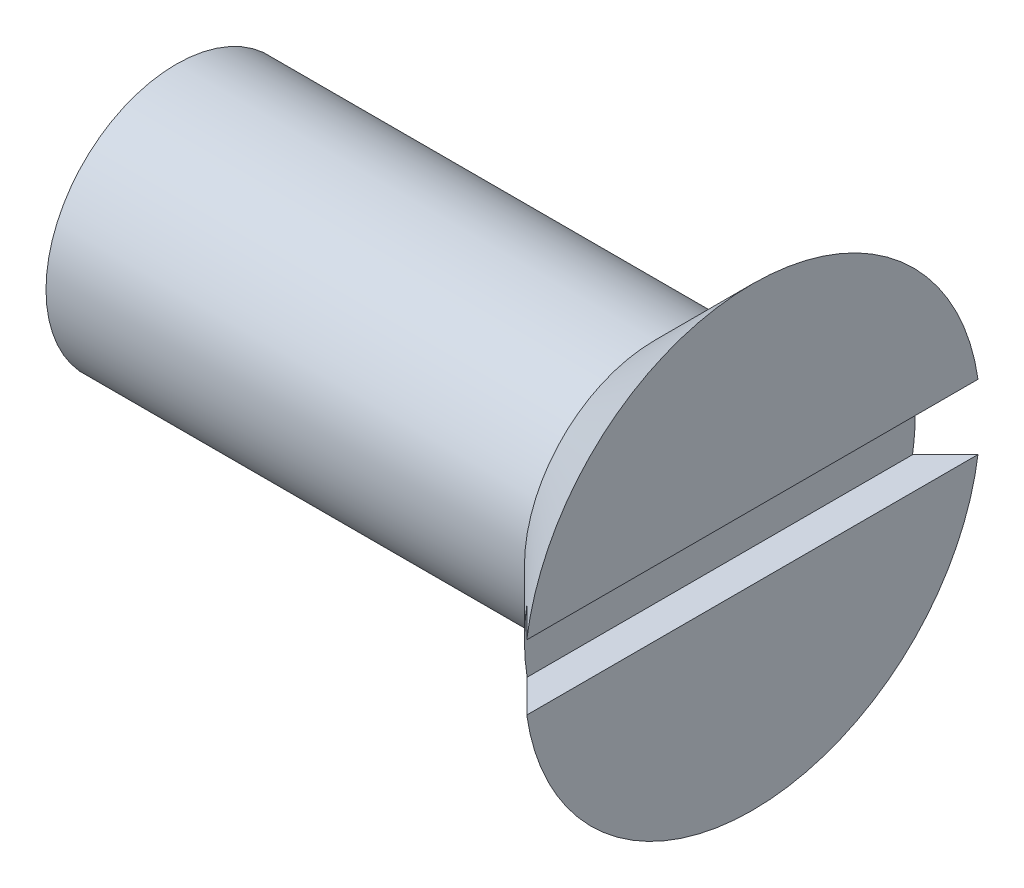
ISO-10303-21;
HEADER;
FILE_DESCRIPTION(('STEP AP214'),'2;1');
FILE_NAME('part.step','',(''),(''),'','','');
FILE_SCHEMA(('AUTOMOTIVE_DESIGN { 1 0 10303 214 1 1 1 1 }'));
ENDSEC;
DATA;
#1=APPLICATION_CONTEXT('core data for automotive mechanical design processes');
#2=APPLICATION_PROTOCOL_DEFINITION('international standard','automotive_design',2000,#1);
#3=PRODUCT_CONTEXT('',#1,'mechanical');
#4=PRODUCT('Part','Part','',(#3));
#5=PRODUCT_RELATED_PRODUCT_CATEGORY('part','',(#4));
#6=PRODUCT_DEFINITION_FORMATION('','',#4);
#7=PRODUCT_DEFINITION_CONTEXT('part definition',#1,'design');
#8=PRODUCT_DEFINITION('design','',#6,#7);
#9=PRODUCT_DEFINITION_SHAPE('','',#8);
#10=(LENGTH_UNIT() NAMED_UNIT(*) SI_UNIT(.MILLI.,.METRE.));
#11=(NAMED_UNIT(*) PLANE_ANGLE_UNIT() SI_UNIT($,.RADIAN.));
#12=(NAMED_UNIT(*) SI_UNIT($,.STERADIAN.) SOLID_ANGLE_UNIT());
#13=UNCERTAINTY_MEASURE_WITH_UNIT(LENGTH_MEASURE(1.E-05),#10,'distance_accuracy_value','');
#14=(GEOMETRIC_REPRESENTATION_CONTEXT(3) GLOBAL_UNCERTAINTY_ASSIGNED_CONTEXT((#13)) GLOBAL_UNIT_ASSIGNED_CONTEXT((#10,
#11,#12)) REPRESENTATION_CONTEXT('',''));
#15=CARTESIAN_POINT('',(0.,0.,0.));
#16=DIRECTION('',(0.,0.,1.));
#17=DIRECTION('',(1.,0.,0.));
#18=AXIS2_PLACEMENT_3D('',#15,#16,#17);
#19=CARTESIAN_POINT('',(0.,-6.99999999999997,0.));
#20=DIRECTION('',(-1.,0.,0.));
#21=DIRECTION('',(0.,0.,1.));
#22=AXIS2_PLACEMENT_3D('',#19,#20,#21);
#23=PLANE('',#22);
#24=CARTESIAN_POINT('',(0.,0.,0.));
#25=DIRECTION('',(1.,0.,0.));
#26=DIRECTION('',(0.,0.,-1.));
#27=AXIS2_PLACEMENT_3D('',#24,#25,#26);
#28=CIRCLE('',#27,6.99999999999997);
#29=CARTESIAN_POINT('',(0.,-1.,6.92820323027548));
#30=VERTEX_POINT('',#29);
#31=CARTESIAN_POINT('',(0.,-1.,-6.92820323027548));
#32=VERTEX_POINT('',#31);
#33=EDGE_CURVE('E114',#30,#32,#28,.T.);
#34=ORIENTED_EDGE('',*,*,#33,.T.);
#35=DIRECTION('',(0.,0.,-1.));
#36=VECTOR('',#35,1.);
#37=CARTESIAN_POINT('',(0.,-1.,6.99999999999997));
#38=LINE('',#37,#36);
#39=EDGE_CURVE('E106',#30,#32,#38,.T.);
#40=ORIENTED_EDGE('',*,*,#39,.F.);
#41=EDGE_LOOP('',(#34,#40));
#42=FACE_BOUND('',#41,.T.);
#43=ADVANCED_FACE('F41',(#42),#23,.F.);
#44=CARTESIAN_POINT('',(0.,1.,-6.92820323027548));
#45=VERTEX_POINT('',#44);
#46=CARTESIAN_POINT('',(0.,1.,6.92820323027548));
#47=VERTEX_POINT('',#46);
#48=EDGE_CURVE('E104',#45,#47,#28,.T.);
#49=ORIENTED_EDGE('',*,*,#48,.T.);
#50=DIRECTION('',(0.,0.,1.));
#51=VECTOR('',#50,1.);
#52=CARTESIAN_POINT('',(0.,1.,6.99999999999997));
#53=LINE('',#52,#51);
#54=EDGE_CURVE('E93',#45,#47,#53,.T.);
#55=ORIENTED_EDGE('',*,*,#54,.F.);
#56=EDGE_LOOP('',(#49,#55));
#57=FACE_BOUND('',#56,.T.);
#58=ADVANCED_FACE('F43',(#57),#23,.F.);
#59=CARTESIAN_POINT('',(-20.,0.,0.));
#60=DIRECTION('',(1.,0.,0.));
#61=DIRECTION('',(0.,0.,-1.));
#62=AXIS2_PLACEMENT_3D('',#59,#60,#61);
#63=CONICAL_SURFACE('',#62,0.,1.04719755119659);
#64=CARTESIAN_POINT('',(-17.6905989232415,0.,0.));
#65=DIRECTION('',(1.,0.,0.));
#66=DIRECTION('',(0.,0.,-1.));
#67=AXIS2_PLACEMENT_3D('',#64,#65,#66);
#68=CIRCLE('',#67,4.);
#69=CARTESIAN_POINT('',(-17.6905989232415,0.,-4.));
#70=VERTEX_POINT('',#69);
#71=EDGE_CURVE('E119',#70,#70,#68,.T.);
#72=ORIENTED_EDGE('',*,*,#71,.F.);
#73=EDGE_LOOP('',(#72));
#74=FACE_BOUND('',#73,.T.);
#75=CARTESIAN_POINT('',(-20.,0.,0.));
#76=VERTEX_POINT('',#75);
#77=VERTEX_LOOP('',#76);
#78=FACE_BOUND('',#77,.T.);
#79=ADVANCED_FACE('F152',(#74,#78),#63,.T.);
#80=CARTESIAN_POINT('',(0.,0.,0.));
#81=DIRECTION('',(1.,0.,0.));
#82=DIRECTION('',(0.,0.,-1.));
#83=AXIS2_PLACEMENT_3D('',#80,#81,#82);
#84=CYLINDRICAL_SURFACE('',#83,4.);
#85=CARTESIAN_POINT('',(-3.,0.,0.));
#86=DIRECTION('',(1.,0.,0.));
#87=DIRECTION('',(0.,0.,-1.));
#88=AXIS2_PLACEMENT_3D('',#85,#86,#87);
#89=CIRCLE('',#88,4.);
#90=CARTESIAN_POINT('',(-3.,0.,-4.));
#91=VERTEX_POINT('',#90);
#92=EDGE_CURVE('E113',#91,#91,#89,.T.);
#93=ORIENTED_EDGE('',*,*,#92,.F.);
#94=EDGE_LOOP('',(#93));
#95=FACE_BOUND('',#94,.T.);
#96=ORIENTED_EDGE('',*,*,#71,.T.);
#97=EDGE_LOOP('',(#96));
#98=FACE_BOUND('',#97,.T.);
#99=ADVANCED_FACE('F166',(#95,#98),#84,.T.);
#100=CARTESIAN_POINT('',(-3.,0.,0.));
#101=DIRECTION('',(1.,0.,0.));
#102=DIRECTION('',(0.,0.,-1.));
#103=AXIS2_PLACEMENT_3D('',#100,#101,#102);
#104=CONICAL_SURFACE('',#103,4.,0.785398163397442);
#105=ORIENTED_EDGE('',*,*,#33,.F.);
#106=CARTESIAN_POINT('',(8.42160130857089,-1.,15.3891451003787));
#107=CARTESIAN_POINT('',(7.89376823648707,-1.,14.8601901033202));
#108=CARTESIAN_POINT('',(7.36598424885411,-1.,14.3311860945462));
#109=CARTESIAN_POINT('',(6.31056705612489,-1.,13.2730072851133));
#110=CARTESIAN_POINT('',(5.78293385414179,-1.,12.7438324813494));
#111=CARTESIAN_POINT('',(4.72766129630269,-1.,11.6850290276662));
#112=CARTESIAN_POINT('',(4.20002203803854,-1.,11.1554002804635));
#113=CARTESIAN_POINT('',(3.14509538498164,-1.,10.0958123391697));
#114=CARTESIAN_POINT('',(2.61780798374322,-1.,9.56585315149631));
#115=CARTESIAN_POINT('',(1.5561951129664,-1.,8.49776751536119));
#116=CARTESIAN_POINT('',(1.02187751001385,-1.,7.95963324310677));
#117=CARTESIAN_POINT('',(0.221148085692358,-1.,7.15166013650105));
#118=CARTESIAN_POINT('',(-0.0456450216041112,-1.,6.88219925510238));
#119=CARTESIAN_POINT('',(-0.578864938990736,-1.,6.34291827912621));
#120=CARTESIAN_POINT('',(-0.845291751156619,-1.,6.0730981866015));
#121=CARTESIAN_POINT('',(-1.37754080415228,-1.,5.53300680225058));
#122=CARTESIAN_POINT('',(-1.64336318992844,-1.,5.2627356533919));
#123=CARTESIAN_POINT('',(-2.17418161528956,-1.,4.72137140705031));
#124=CARTESIAN_POINT('',(-2.43917763665781,-1.,4.45027829170385));
#125=CARTESIAN_POINT('',(-2.96777351719311,-1.,3.90678389833318));
#126=CARTESIAN_POINT('',(-3.23137351755347,-1.,3.63438275812903));
#127=CARTESIAN_POINT('',(-3.62479523491607,-1.,3.22389279610353));
#128=CARTESIAN_POINT('',(-3.75560382891893,-1.,3.08675050893772));
#129=CARTESIAN_POINT('',(-4.01624541521848,-1.,2.81154262022564));
#130=CARTESIAN_POINT('',(-4.146078421032,-1.,2.67347703152205));
#131=CARTESIAN_POINT('',(-4.31013571849825,-1.,2.49710948732357));
#132=CARTESIAN_POINT('',(-4.3450576075036,-1.,2.4594563460965));
#133=CARTESIAN_POINT('',(-4.41477317933616,-1.,2.38403138308479));
#134=CARTESIAN_POINT('',(-4.44956686179082,-1.,2.34625956095586));
#135=CARTESIAN_POINT('',(-4.5537311863043,-1.,2.23274246802549));
#136=CARTESIAN_POINT('',(-4.62288396285747,-1.,2.15679679688145));
#137=CARTESIAN_POINT('',(-4.76036996634311,-1.,2.00425406580446));
#138=CARTESIAN_POINT('',(-4.82870368801197,-1.,1.92765745238299));
#139=CARTESIAN_POINT('',(-4.9643053689449,-1.,1.7735278708926));
#140=CARTESIAN_POINT('',(-5.03157336863006,-1.,1.69599493853422));
#141=CARTESIAN_POINT('',(-5.14609741835981,-1.,1.56135584755979));
#142=CARTESIAN_POINT('',(-5.19371932662655,-1.,1.50456143616942));
#143=CARTESIAN_POINT('',(-5.28789590902979,-1.,1.39009421696645));
#144=CARTESIAN_POINT('',(-5.33445062004548,-1.,1.33242143962257));
#145=CARTESIAN_POINT('',(-5.42617009529478,-1.,1.21582858144294));
#146=CARTESIAN_POINT('',(-5.47133254362658,-1.,1.15690667137103));
#147=CARTESIAN_POINT('',(-5.55957261366233,-1.,1.03752359300985));
#148=CARTESIAN_POINT('',(-5.60265067655823,-1.,0.977062754629365));
#149=CARTESIAN_POINT('',(-5.67237546537157,-1.,0.873801937075218));
#150=CARTESIAN_POINT('',(-5.69985545083754,-1.,0.831567276309316));
#151=CARTESIAN_POINT('',(-5.75289989950478,-1.,0.745916576214364));
#152=CARTESIAN_POINT('',(-5.77846485438427,-1.,0.702500844051027));
#153=CARTESIAN_POINT('',(-5.8269658684795,-1.,0.614299075317251));
#154=CARTESIAN_POINT('',(-5.84990626469746,-1.,0.569515458990442));
#155=CARTESIAN_POINT('',(-5.89222910121142,-1.,0.478316926064179));
#156=CARTESIAN_POINT('',(-5.91161414675235,-1.,0.431903233886991));
#157=CARTESIAN_POINT('',(-5.94963019383425,-1.,0.325977970942797));
#158=CARTESIAN_POINT('',(-5.9669781727691,-1.,0.265983139860756));
#159=CARTESIAN_POINT('',(-5.99142382215522,-1.,0.14404453570909));
#160=CARTESIAN_POINT('',(-5.9985585113096,-1.,0.0821086369547092));
#161=CARTESIAN_POINT('',(-6.00104609577415,-1.,-0.0423372457115582));
#162=CARTESIAN_POINT('',(-5.99633829684546,-1.,-0.104848544376489));
#163=CARTESIAN_POINT('',(-5.97612782065426,-1.,-0.228158745378406));
#164=CARTESIAN_POINT('',(-5.96059504717466,-1.,-0.288952380634983));
#165=CARTESIAN_POINT('',(-5.92089845859804,-1.,-0.409670597297114));
#166=CARTESIAN_POINT('',(-5.89647577878384,-1.,-0.469506000793068));
#167=CARTESIAN_POINT('',(-5.84184552592907,-1.,-0.586519821089633));
#168=CARTESIAN_POINT('',(-5.81162749979887,-1.,-0.643693201208992));
#169=CARTESIAN_POINT('',(-5.74709196220479,-1.,-0.756253498205937));
#170=CARTESIAN_POINT('',(-5.71274316618776,-1.,-0.811622147479294));
#171=CARTESIAN_POINT('',(-5.64142299837373,-1.,-0.920554717842144));
#172=CARTESIAN_POINT('',(-5.60445388570668,-1.,-0.974120136215547));
#173=CARTESIAN_POINT('',(-5.52539268459334,-1.,-1.08446941212636));
#174=CARTESIAN_POINT('',(-5.48313366489105,-1.,-1.14113281694056));
#175=CARTESIAN_POINT('',(-5.39706280745057,-1.,-1.25327192125102));
#176=CARTESIAN_POINT('',(-5.35325075804477,-1.,-1.30874745718306));
#177=CARTESIAN_POINT('',(-5.22010322486528,-1.,-1.47387887955582));
#178=CARTESIAN_POINT('',(-5.12909764333293,-1.,-1.58218391022285));
#179=CARTESIAN_POINT('',(-4.94439383170442,-1.,-1.79679064143761));
#180=CARTESIAN_POINT('',(-4.8506909657079,-1.,-1.90308829983684));
#181=CARTESIAN_POINT('',(-4.66169874479804,-1.,-2.11420508174284));
#182=CARTESIAN_POINT('',(-4.566409863065,-1.,-2.21902462958909));
#183=CARTESIAN_POINT('',(-4.37504367880261,-1.,-2.427360237784));
#184=CARTESIAN_POINT('',(-4.27896959082215,-1.,-2.53087926109047));
#185=CARTESIAN_POINT('',(-4.08606160450304,-1.,-2.73722034216943));
#186=CARTESIAN_POINT('',(-3.98922765080389,-1.,-2.84004234812377));
#187=CARTESIAN_POINT('',(-3.79511858542751,-1.,-3.04505337883507));
#188=CARTESIAN_POINT('',(-3.69784407861175,-1.,-3.14724297695839));
#189=CARTESIAN_POINT('',(-3.5028849108472,-1.,-3.35122501751528));
#190=CARTESIAN_POINT('',(-3.40520026017564,-1.,-3.45301746977853));
#191=CARTESIAN_POINT('',(-3.11260162828247,-1.,-3.75697969435263));
#192=CARTESIAN_POINT('',(-2.91722292729593,-1.,-3.95870196591955));
#193=CARTESIAN_POINT('',(-2.52568284552746,-1.,-4.36138587092227));
#194=CARTESIAN_POINT('',(-2.32952146131796,-1.,-4.5623475010195));
#195=CARTESIAN_POINT('',(-1.74025356423569,-1.,-5.16448073137039));
#196=CARTESIAN_POINT('',(-1.34637110503887,-1.,-5.56489262068049));
#197=CARTESIAN_POINT('',(-0.557390393075055,-1.,-6.36485950441325));
#198=CARTESIAN_POINT('',(-0.162291684755753,-1.,-6.76441404864033));
#199=CARTESIAN_POINT('',(0.628526559937492,-1.,-7.56290082415973));
#200=CARTESIAN_POINT('',(1.02424609043271,-1.,-7.96183306127434));
#201=CARTESIAN_POINT('',(1.81604192374061,-1.,-8.75927038328849));
#202=CARTESIAN_POINT('',(2.21211819045346,-1.,-9.15777550404968));
#203=CARTESIAN_POINT('',(3.00453846130919,-1.,-9.95452139798975));
#204=CARTESIAN_POINT('',(3.4008824661118,-1.,-10.3527621705124));
#205=CARTESIAN_POINT('',(4.59010347571042,-1.,-11.5471211163621));
#206=CARTESIAN_POINT('',(5.38325697698686,-1.,-12.3429639602434));
#207=CARTESIAN_POINT('',(6.3636536386979,-1.,-13.3261932305284));
#208=CARTESIAN_POINT('',(6.55070903906387,-1.,-13.5137669726756));
#209=CARTESIAN_POINT('',(6.9248437629218,-1.,-13.8888971637703));
#210=CARTESIAN_POINT('',(7.11192308677589,-1.,-14.0764536123566));
#211=CARTESIAN_POINT('',(7.48609461374762,-1.,-14.4515434506334));
#212=CARTESIAN_POINT('',(7.67318681637454,-1.,-14.6390768408134));
#213=CARTESIAN_POINT('',(8.04738406842208,-1.,-15.0141242295303));
#214=CARTESIAN_POINT('',(8.23448911755927,-1.,-15.20163822835));
#215=CARTESIAN_POINT('',(8.42160130857089,-1.,-15.3891451003787));
#216=B_SPLINE_CURVE_WITH_KNOTS('',3,(#106,#107,#108,#109,#110,#111,#112,#113,#114,#115,#116,
#117,#118,#119,#120,#121,#122,#123,#124,#125,#126,#127,#128,#129,#130,#131,#132,#133,#134,#135,
#136,#137,#138,#139,#140,#141,#142,#143,#144,#145,#146,#147,#148,#149,#150,#151,#152,#153,#154,
#155,#156,#157,#158,#159,#160,#161,#162,#163,#164,#165,#166,#167,#168,#169,#170,#171,#172,#173,
#174,#175,#176,#177,#178,#179,#180,#181,#182,#183,#184,#185,#186,#187,#188,#189,#190,#191,#192,
#193,#194,#195,#196,#197,#198,#199,#200,#201,#202,#203,#204,#205,#206,#207,#208,#209,#210,#211,
#212,#213,#214,#215),.UNSPECIFIED.,.F.,.F.,(4,2,2,2,2,2,2,2,2,2,2,2,2,2,2,2,2,2,2,2,2,2,2,2,2,2,
2,2,2,2,2,2,2,2,2,2,2,2,2,2,2,2,2,2,2,2,2,2,2,2,2,2,2,2,4),(0.,2.24178732176105,
4.48361799451791,6.72642597696813,8.96919167899877,11.2442191663916,12.3817994869698,
13.5193733342978,14.6566372309917,15.7939260232374,16.9310975052452,17.4996634103223,
18.0682214233022,18.2222850318348,18.3763490877046,18.6844822275601,18.9924187734408,
19.3003436116975,19.522687952188,19.7450245974953,19.9677130505937,20.190354160226,
20.3414800489262,20.4925670025735,20.6434005690661,20.7941231641647,20.9808009058749,
21.1668002942535,21.3537548930165,21.5412313581741,21.7346721494168,21.9284651890619,
22.1238312449933,22.3190308664272,22.5310523970455,22.7431029367421,23.1674117576819,
23.5924994239495,24.0174624631992,24.4411532118737,24.8648751208285,25.2881293699982,
25.7113730759662,26.5538549422027,27.3963405019454,29.0813452463045,30.76708531306,
32.452809512322,34.1383789098766,35.8239524760869,39.1947272227891,39.9894364080984,
40.7841595353565,41.5788609769453,42.3735484571115),.UNSPECIFIED.);
#217=CARTESIAN_POINT('',(-1.,-1.,5.91607978309959));
#218=VERTEX_POINT('',#217);
#219=EDGE_CURVE('E11',#30,#218,#216,.T.);
#220=ORIENTED_EDGE('',*,*,#219,.T.);
#221=CARTESIAN_POINT('',(-1.,0.,0.));
#222=DIRECTION('',(1.,0.,0.));
#223=DIRECTION('',(0.,0.,-1.));
#224=AXIS2_PLACEMENT_3D('',#221,#222,#223);
#225=CIRCLE('',#224,5.99999999999998);
#226=CARTESIAN_POINT('',(-1.,1.,5.91607978309959));
#227=VERTEX_POINT('',#226);
#228=EDGE_CURVE('E128',#227,#218,#225,.T.);
#229=ORIENTED_EDGE('',*,*,#228,.F.);
#230=CARTESIAN_POINT('',(8.42160130857088,1.,-15.3891451003787));
#231=CARTESIAN_POINT('',(7.89376823648706,1.,-14.8601901033202));
#232=CARTESIAN_POINT('',(7.3659842488541,1.,-14.3311860945462));
#233=CARTESIAN_POINT('',(6.31056705612489,1.,-13.2730072851133));
#234=CARTESIAN_POINT('',(5.78293385414178,1.,-12.7438324813494));
#235=CARTESIAN_POINT('',(4.72766129630268,1.,-11.6850290276662));
#236=CARTESIAN_POINT('',(4.20002203803853,1.,-11.1554002804635));
#237=CARTESIAN_POINT('',(3.14509538498163,1.,-10.0958123391697));
#238=CARTESIAN_POINT('',(2.61780798374321,1.,-9.5658531514963));
#239=CARTESIAN_POINT('',(1.55619511296638,1.,-8.49776751536118));
#240=CARTESIAN_POINT('',(1.02187751001384,1.,-7.95963324310676));
#241=CARTESIAN_POINT('',(0.221148085692349,1.,-7.15166013650104));
#242=CARTESIAN_POINT('',(-0.0456450216041205,1.,-6.88219925510237));
#243=CARTESIAN_POINT('',(-0.578864938990745,1.,-6.3429182791262));
#244=CARTESIAN_POINT('',(-0.845291751156626,1.,-6.07309818660149));
#245=CARTESIAN_POINT('',(-1.37754080415228,1.,-5.53300680225057));
#246=CARTESIAN_POINT('',(-1.64336318992845,1.,-5.26273565339189));
#247=CARTESIAN_POINT('',(-2.17418161528957,1.,-4.72137140705031));
#248=CARTESIAN_POINT('',(-2.43917763665781,1.,-4.45027829170385));
#249=CARTESIAN_POINT('',(-2.96777351719312,1.,-3.90678389833318));
#250=CARTESIAN_POINT('',(-3.23137351755347,1.,-3.63438275812903));
#251=CARTESIAN_POINT('',(-3.62479523491607,1.,-3.22389279610352));
#252=CARTESIAN_POINT('',(-3.75560382891894,1.,-3.08675050893772));
#253=CARTESIAN_POINT('',(-4.01624541521848,1.,-2.81154262022564));
#254=CARTESIAN_POINT('',(-4.146078421032,1.,-2.67347703152205));
#255=CARTESIAN_POINT('',(-4.31013571849824,1.,-2.49710948732357));
#256=CARTESIAN_POINT('',(-4.3450576075036,1.,-2.4594563460965));
#257=CARTESIAN_POINT('',(-4.41477317933616,1.,-2.38403138308479));
#258=CARTESIAN_POINT('',(-4.44956686179082,1.,-2.34625956095586));
#259=CARTESIAN_POINT('',(-4.5537311863043,1.,-2.23274246802549));
#260=CARTESIAN_POINT('',(-4.62288396285746,1.,-2.15679679688146));
#261=CARTESIAN_POINT('',(-4.76036996634311,1.,-2.00425406580446));
#262=CARTESIAN_POINT('',(-4.82870368801197,1.,-1.92765745238299));
#263=CARTESIAN_POINT('',(-4.9643053689449,1.,-1.7735278708926));
#264=CARTESIAN_POINT('',(-5.03157336863006,1.,-1.69599493853422));
#265=CARTESIAN_POINT('',(-5.14609741835981,1.,-1.56135584755979));
#266=CARTESIAN_POINT('',(-5.19371932662655,1.,-1.50456143616942));
#267=CARTESIAN_POINT('',(-5.28789590902979,1.,-1.39009421696645));
#268=CARTESIAN_POINT('',(-5.33445062004548,1.,-1.33242143962257));
#269=CARTESIAN_POINT('',(-5.42617009529478,1.,-1.21582858144294));
#270=CARTESIAN_POINT('',(-5.47133254362658,1.,-1.15690667137103));
#271=CARTESIAN_POINT('',(-5.55957261366233,1.,-1.03752359300985));
#272=CARTESIAN_POINT('',(-5.60265067655823,1.,-0.977062754629367));
#273=CARTESIAN_POINT('',(-5.67237546537157,1.,-0.873801937075219));
#274=CARTESIAN_POINT('',(-5.69985545083754,1.,-0.831567276309316));
#275=CARTESIAN_POINT('',(-5.75289989950478,1.,-0.745916576214363));
#276=CARTESIAN_POINT('',(-5.77846485438427,1.,-0.702500844051026));
#277=CARTESIAN_POINT('',(-5.8269658684795,1.,-0.61429907531725));
#278=CARTESIAN_POINT('',(-5.84990626469746,1.,-0.569515458990439));
#279=CARTESIAN_POINT('',(-5.89222910121142,1.,-0.478316926064176));
#280=CARTESIAN_POINT('',(-5.91161414675235,1.,-0.431903233886989));
#281=CARTESIAN_POINT('',(-5.94963019383426,1.,-0.325977970942796));
#282=CARTESIAN_POINT('',(-5.96697817276911,1.,-0.265983139860755));
#283=CARTESIAN_POINT('',(-5.99142382215522,1.,-0.144044535709089));
#284=CARTESIAN_POINT('',(-5.9985585113096,1.,-0.0821086369547082));
#285=CARTESIAN_POINT('',(-6.00104609577415,1.,0.0423372457115605));
#286=CARTESIAN_POINT('',(-5.99633829684546,1.,0.104848544376492));
#287=CARTESIAN_POINT('',(-5.97612782065426,1.,0.22815874537841));
#288=CARTESIAN_POINT('',(-5.96059504717466,1.,0.288952380634985));
#289=CARTESIAN_POINT('',(-5.92089845859804,1.,0.409670597297115));
#290=CARTESIAN_POINT('',(-5.89647577878384,1.,0.469506000793069));
#291=CARTESIAN_POINT('',(-5.84184552592907,1.,0.586519821089633));
#292=CARTESIAN_POINT('',(-5.81162749979887,1.,0.643693201208992));
#293=CARTESIAN_POINT('',(-5.74709196220478,1.,0.756253498205938));
#294=CARTESIAN_POINT('',(-5.71274316618775,1.,0.811622147479296));
#295=CARTESIAN_POINT('',(-5.64142299837373,1.,0.920554717842146));
#296=CARTESIAN_POINT('',(-5.60445388570668,1.,0.97412013621555));
#297=CARTESIAN_POINT('',(-5.52539268459334,1.,1.08446941212637));
#298=CARTESIAN_POINT('',(-5.48313366489105,1.,1.14113281694057));
#299=CARTESIAN_POINT('',(-5.39706280745057,1.,1.25327192125103));
#300=CARTESIAN_POINT('',(-5.35325075804477,1.,1.30874745718307));
#301=CARTESIAN_POINT('',(-5.22010322486528,1.,1.47387887955582));
#302=CARTESIAN_POINT('',(-5.12909764333292,1.,1.58218391022286));
#303=CARTESIAN_POINT('',(-4.94439383170442,1.,1.79679064143761));
#304=CARTESIAN_POINT('',(-4.85069096570789,1.,1.90308829983685));
#305=CARTESIAN_POINT('',(-4.66169874479803,1.,2.11420508174285));
#306=CARTESIAN_POINT('',(-4.56640986306499,1.,2.2190246295891));
#307=CARTESIAN_POINT('',(-4.37504367880261,1.,2.42736023778401));
#308=CARTESIAN_POINT('',(-4.27896959082214,1.,2.53087926109048));
#309=CARTESIAN_POINT('',(-4.08606160450303,1.,2.73722034216944));
#310=CARTESIAN_POINT('',(-3.98922765080388,1.,2.84004234812378));
#311=CARTESIAN_POINT('',(-3.79511858542749,1.,3.04505337883509));
#312=CARTESIAN_POINT('',(-3.69784407861173,1.,3.1472429769584));
#313=CARTESIAN_POINT('',(-3.50288491084718,1.,3.35122501751529));
#314=CARTESIAN_POINT('',(-3.40520026017563,1.,3.45301746977854));
#315=CARTESIAN_POINT('',(-3.11260162828246,1.,3.75697969435265));
#316=CARTESIAN_POINT('',(-2.91722292729591,1.,3.95870196591957));
#317=CARTESIAN_POINT('',(-2.52568284552744,1.,4.36138587092229));
#318=CARTESIAN_POINT('',(-2.32952146131794,1.,4.56234750101952));
#319=CARTESIAN_POINT('',(-1.74025356423567,1.,5.16448073137041));
#320=CARTESIAN_POINT('',(-1.34637110503884,1.,5.56489262068052));
#321=CARTESIAN_POINT('',(-0.557390393075026,1.,6.36485950441328));
#322=CARTESIAN_POINT('',(-0.162291684755723,1.,6.76441404864036));
#323=CARTESIAN_POINT('',(0.628526559937525,1.,7.56290082415976));
#324=CARTESIAN_POINT('',(1.02424609043275,1.,7.96183306127437));
#325=CARTESIAN_POINT('',(1.81604192374065,1.,8.75927038328853));
#326=CARTESIAN_POINT('',(2.2121181904535,1.,9.15777550404972));
#327=CARTESIAN_POINT('',(3.00453846130924,1.,9.9545213979898));
#328=CARTESIAN_POINT('',(3.40088246611185,1.,10.3527621705125));
#329=CARTESIAN_POINT('',(4.59010347571048,1.,11.5471211163622));
#330=CARTESIAN_POINT('',(5.38325697698692,1.,12.3429639602435));
#331=CARTESIAN_POINT('',(6.36365363869796,1.,13.3261932305285));
#332=CARTESIAN_POINT('',(6.55070903906393,1.,13.5137669726757));
#333=CARTESIAN_POINT('',(6.92484376292184,1.,13.8888971637703));
#334=CARTESIAN_POINT('',(7.11192308677593,1.,14.0764536123566));
#335=CARTESIAN_POINT('',(7.48609461374765,1.,14.4515434506334));
#336=CARTESIAN_POINT('',(7.67318681637456,1.,14.6390768408134));
#337=CARTESIAN_POINT('',(8.04738406842209,1.,15.0141242295303));
#338=CARTESIAN_POINT('',(8.23448911755927,1.,15.20163822835));
#339=CARTESIAN_POINT('',(8.42160130857089,1.,15.3891451003787));
#340=B_SPLINE_CURVE_WITH_KNOTS('',3,(#230,#231,#232,#233,#234,#235,#236,#237,#238,#239,#240,
#241,#242,#243,#244,#245,#246,#247,#248,#249,#250,#251,#252,#253,#254,#255,#256,#257,#258,#259,
#260,#261,#262,#263,#264,#265,#266,#267,#268,#269,#270,#271,#272,#273,#274,#275,#276,#277,#278,
#279,#280,#281,#282,#283,#284,#285,#286,#287,#288,#289,#290,#291,#292,#293,#294,#295,#296,#297,
#298,#299,#300,#301,#302,#303,#304,#305,#306,#307,#308,#309,#310,#311,#312,#313,#314,#315,#316,
#317,#318,#319,#320,#321,#322,#323,#324,#325,#326,#327,#328,#329,#330,#331,#332,#333,#334,#335,
#336,#337,#338,#339),.UNSPECIFIED.,.F.,.F.,(4,2,2,2,2,2,2,2,2,2,2,2,2,2,2,2,2,2,2,2,2,2,2,2,2,2,
2,2,2,2,2,2,2,2,2,2,2,2,2,2,2,2,2,2,2,2,2,2,2,2,2,2,2,2,4),(0.,2.24178732176106,
4.48361799451791,6.72642597696815,8.96919167899878,11.2442191663916,12.3817994869698,
13.5193733342978,14.6566372309917,15.7939260232374,16.9310975052452,17.4996634103223,
18.0682214233022,18.2222850318348,18.3763490877046,18.6844822275601,18.9924187734408,
19.3003436116975,19.522687952188,19.7450245974954,19.9677130505937,20.190354160226,
20.3414800489262,20.4925670025735,20.6434005690661,20.7941231641647,20.9808009058749,
21.1668002942535,21.3537548930165,21.5412313581741,21.7346721494168,21.9284651890619,
22.1238312449933,22.3190308664272,22.5310523970455,22.7431029367421,23.1674117576819,
23.5924994239495,24.0174624631992,24.4411532118737,24.8648751208285,25.2881293699982,
25.7113730759662,26.5538549422027,27.3963405019455,29.0813452463046,30.7670853130601,
32.4528095123221,34.1383789098767,35.823952476087,39.1947272227892,39.9894364080984,
40.7841595353565,41.5788609769453,42.3735484571114),.UNSPECIFIED.);
#341=EDGE_CURVE('E57',#227,#47,#340,.T.);
#342=ORIENTED_EDGE('',*,*,#341,.T.);
#343=ORIENTED_EDGE('',*,*,#48,.F.);
#344=CARTESIAN_POINT('',(-1.,1.,-5.91607978309959));
#345=VERTEX_POINT('',#344);
#346=EDGE_CURVE('E90',#45,#345,#340,.T.);
#347=ORIENTED_EDGE('',*,*,#346,.T.);
#348=CARTESIAN_POINT('',(-1.,-1.,-5.91607978309959));
#349=VERTEX_POINT('',#348);
#350=EDGE_CURVE('E101',#349,#345,#225,.T.);
#351=ORIENTED_EDGE('',*,*,#350,.F.);
#352=EDGE_CURVE('E45',#349,#32,#216,.T.);
#353=ORIENTED_EDGE('',*,*,#352,.T.);
#354=EDGE_LOOP('',(#105,#220,#229,#342,#343,#347,#351,#353));
#355=FACE_BOUND('',#354,.T.);
#356=ORIENTED_EDGE('',*,*,#92,.T.);
#357=EDGE_LOOP('',(#356));
#358=FACE_BOUND('',#357,.T.);
#359=ADVANCED_FACE('F109',(#355,#358),#104,.T.);
#360=CARTESIAN_POINT('',(-1.,-1.,6.99999999999997));
#361=DIRECTION('',(0.,-1.,0.));
#362=DIRECTION('',(0.,0.,-1.));
#363=AXIS2_PLACEMENT_3D('',#360,#361,#362);
#364=PLANE('',#363);
#365=ORIENTED_EDGE('',*,*,#39,.T.);
#366=ORIENTED_EDGE('',*,*,#352,.F.);
#367=DIRECTION('',(0.,0.,-1.));
#368=VECTOR('',#367,1.);
#369=CARTESIAN_POINT('',(-1.,-1.,6.99999999999997));
#370=LINE('',#369,#368);
#371=EDGE_CURVE('E64',#218,#349,#370,.T.);
#372=ORIENTED_EDGE('',*,*,#371,.F.);
#373=ORIENTED_EDGE('',*,*,#219,.F.);
#374=EDGE_LOOP('',(#365,#366,#372,#373));
#375=FACE_BOUND('',#374,.T.);
#376=ADVANCED_FACE('F139',(#375),#364,.F.);
#377=CARTESIAN_POINT('',(-1.,1.,6.99999999999997));
#378=DIRECTION('',(0.,1.,0.));
#379=DIRECTION('',(0.,0.,1.));
#380=AXIS2_PLACEMENT_3D('',#377,#378,#379);
#381=PLANE('',#380);
#382=ORIENTED_EDGE('',*,*,#54,.T.);
#383=ORIENTED_EDGE('',*,*,#341,.F.);
#384=DIRECTION('',(0.,0.,1.));
#385=VECTOR('',#384,1.);
#386=CARTESIAN_POINT('',(-1.,1.,6.99999999999997));
#387=LINE('',#386,#385);
#388=EDGE_CURVE('E96',#345,#227,#387,.T.);
#389=ORIENTED_EDGE('',*,*,#388,.F.);
#390=ORIENTED_EDGE('',*,*,#346,.F.);
#391=EDGE_LOOP('',(#382,#383,#389,#390));
#392=FACE_BOUND('',#391,.T.);
#393=ADVANCED_FACE('F92',(#392),#381,.F.);
#394=CARTESIAN_POINT('',(-1.,0.,0.));
#395=DIRECTION('',(1.,0.,0.));
#396=DIRECTION('',(0.,0.,-1.));
#397=AXIS2_PLACEMENT_3D('',#394,#395,#396);
#398=PLANE('',#397);
#399=ORIENTED_EDGE('',*,*,#228,.T.);
#400=ORIENTED_EDGE('',*,*,#371,.T.);
#401=ORIENTED_EDGE('',*,*,#350,.T.);
#402=ORIENTED_EDGE('',*,*,#388,.T.);
#403=EDGE_LOOP('',(#399,#400,#401,#402));
#404=FACE_BOUND('',#403,.T.);
#405=ADVANCED_FACE('F138',(#404),#398,.T.);
#406=CLOSED_SHELL('',(#43,#58,#79,#99,#359,#376,#393,#405));
#407=MANIFOLD_SOLID_BREP('B2',#406);
#408=ADVANCED_BREP_SHAPE_REPRESENTATION('',(#18,#407),#14);
#409=SHAPE_DEFINITION_REPRESENTATION(#9,#408);
ENDSEC;
END-ISO-10303-21;
